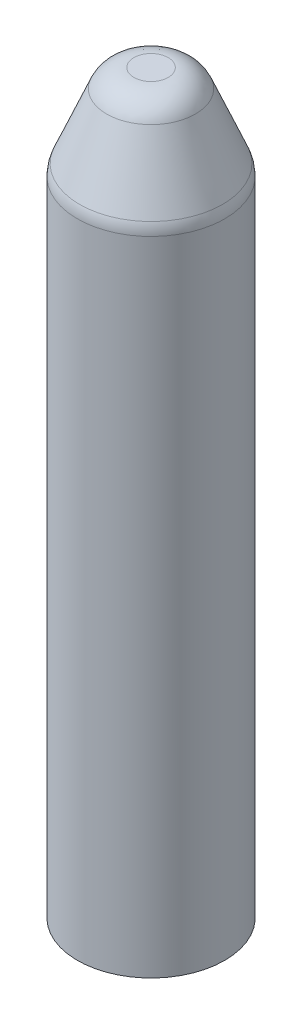
ISO-10303-21;
HEADER;
FILE_DESCRIPTION(('STEP AP214'),'2;1');
FILE_NAME('part.step','',(''),(''),'','','');
FILE_SCHEMA(('AUTOMOTIVE_DESIGN { 1 0 10303 214 1 1 1 1 }'));
ENDSEC;
DATA;
#1=APPLICATION_CONTEXT('core data for automotive mechanical design processes');
#2=APPLICATION_PROTOCOL_DEFINITION('international standard','automotive_design',2000,#1);
#3=PRODUCT_CONTEXT('',#1,'mechanical');
#4=PRODUCT('Part','Part','',(#3));
#5=PRODUCT_RELATED_PRODUCT_CATEGORY('part','',(#4));
#6=PRODUCT_DEFINITION_FORMATION('','',#4);
#7=PRODUCT_DEFINITION_CONTEXT('part definition',#1,'design');
#8=PRODUCT_DEFINITION('design','',#6,#7);
#9=PRODUCT_DEFINITION_SHAPE('','',#8);
#10=(LENGTH_UNIT() NAMED_UNIT(*) SI_UNIT(.MILLI.,.METRE.));
#11=(NAMED_UNIT(*) PLANE_ANGLE_UNIT() SI_UNIT($,.RADIAN.));
#12=(NAMED_UNIT(*) SI_UNIT($,.STERADIAN.) SOLID_ANGLE_UNIT());
#13=UNCERTAINTY_MEASURE_WITH_UNIT(LENGTH_MEASURE(1.E-05),#10,'distance_accuracy_value','');
#14=(GEOMETRIC_REPRESENTATION_CONTEXT(3) GLOBAL_UNCERTAINTY_ASSIGNED_CONTEXT((#13)) GLOBAL_UNIT_ASSIGNED_CONTEXT((#10,
#11,#12)) REPRESENTATION_CONTEXT('',''));
#15=CARTESIAN_POINT('',(0.,0.,0.));
#16=DIRECTION('',(0.,0.,1.));
#17=DIRECTION('',(1.,0.,0.));
#18=AXIS2_PLACEMENT_3D('',#15,#16,#17);
#19=CARTESIAN_POINT('',(0.,5.,-6.2));
#20=DIRECTION('',(0.,-1.,0.));
#21=DIRECTION('',(-1.,0.,0.));
#22=AXIS2_PLACEMENT_3D('',#19,#20,#21);
#23=PLANE('',#22);
#24=CARTESIAN_POINT('',(0.,5.,-6.2));
#25=DIRECTION('',(0.,-1.,0.));
#26=DIRECTION('',(1.,0.,0.));
#27=AXIS2_PLACEMENT_3D('',#24,#25,#26);
#28=CIRCLE('',#27,0.116666666667);
#29=CARTESIAN_POINT('',(0.116666666667,5.,-6.2));
#30=VERTEX_POINT('',#29);
#31=EDGE_CURVE('E28',#30,#30,#28,.T.);
#32=ORIENTED_EDGE('',*,*,#31,.F.);
#33=EDGE_LOOP('',(#32));
#34=FACE_BOUND('',#33,.T.);
#35=ADVANCED_FACE('F16',(#34),#23,.F.);
#36=CARTESIAN_POINT('',(0.301282051282,4.876923076923,-6.2));
#37=CARTESIAN_POINT('',(0.286205061447,4.913107852526,-6.2));
#38=CARTESIAN_POINT('',(0.262617997576,4.945746033968,-6.2));
#39=CARTESIAN_POINT('',(0.231559197431,4.972338796147,-6.2));
#40=CARTESIAN_POINT('',(0.19506633998,4.990780472366,-6.2));
#41=CARTESIAN_POINT('',(0.155866840237,5.,-6.2));
#42=CARTESIAN_POINT('',(0.116666666667,5.,-6.2));
#43=(BOUNDED_CURVE() B_SPLINE_CURVE(6,(#36,#37,#38,#39,#40,#41,#42),.UNSPECIFIED.,.F.,
.F.) B_SPLINE_CURVE_WITH_KNOTS((7,7),(0.3947911197,1.570796326795),
.UNSPECIFIED.) CURVE() GEOMETRIC_REPRESENTATION_ITEM() RATIONAL_B_SPLINE_CURVE((1.,1.,1.,1.,1.,
1.,1.)) REPRESENTATION_ITEM(''));
#44=CARTESIAN_POINT('',(0.,4.8,-6.2));
#45=DIRECTION('',(0.,-1.,0.));
#46=AXIS1_PLACEMENT('',#44,#45);
#47=SURFACE_OF_REVOLUTION('',#43,#46);
#48=ORIENTED_EDGE('',*,*,#31,.T.);
#49=CARTESIAN_POINT('',(0.116666666667,4.8,-6.2));
#50=DIRECTION('',(0.,0.,1.));
#51=DIRECTION('',(1.,0.,0.));
#52=AXIS2_PLACEMENT_3D('',#49,#50,#51);
#53=CIRCLE('',#52,0.2);
#54=CARTESIAN_POINT('',(0.301282051282,4.876923076923,-6.2));
#55=VERTEX_POINT('',#54);
#56=EDGE_CURVE('E11',#55,#30,#53,.T.);
#57=ORIENTED_EDGE('',*,*,#56,.F.);
#58=CARTESIAN_POINT('',(0.,4.876923076923,-6.2));
#59=DIRECTION('',(0.,-1.,0.));
#60=DIRECTION('',(1.,0.,0.));
#61=AXIS2_PLACEMENT_3D('',#58,#59,#60);
#62=CIRCLE('',#61,0.301282051282);
#63=EDGE_CURVE('E150',#55,#55,#62,.T.);
#64=ORIENTED_EDGE('',*,*,#63,.F.);
#65=ORIENTED_EDGE('',*,*,#56,.T.);
#66=EDGE_LOOP('',(#48,#57,#64,#65));
#67=FACE_BOUND('',#66,.T.);
#68=ADVANCED_FACE('F18',(#67),#47,.F.);
#69=CARTESIAN_POINT('',(0.,4.4,-6.2));
#70=DIRECTION('',(0.,-1.,0.));
#71=DIRECTION('',(1.,0.,0.));
#72=AXIS2_PLACEMENT_3D('',#69,#70,#71);
#73=CONICAL_SURFACE('',#72,0.5,0.3947911197);
#74=ORIENTED_EDGE('',*,*,#63,.T.);
#75=DIRECTION('',(-0.38461538461503,0.923076923077071,0.));
#76=VECTOR('',#75,1.);
#77=CARTESIAN_POINT('',(0.5,4.4,-6.2));
#78=LINE('',#77,#76);
#79=CARTESIAN_POINT('',(0.484615384615,4.436923076923,-6.2));
#80=VERTEX_POINT('',#79);
#81=EDGE_CURVE('E141',#80,#55,#78,.T.);
#82=ORIENTED_EDGE('',*,*,#81,.F.);
#83=CARTESIAN_POINT('',(0.484615384615,4.436923076923,-6.2));
#84=CARTESIAN_POINT('',(0.484615384615,4.436923076923,-5.927192615032));
#85=CARTESIAN_POINT('',(0.316637594826,4.436923076923,-5.647506525371));
#86=CARTESIAN_POINT('',(-0.04313086997286,4.436923076923,-5.479124184144));
#87=CARTESIAN_POINT('',(-0.460995407463,4.436923076923,-5.599990781822));
#88=CARTESIAN_POINT('',(-0.779681050796,4.436923076923,-5.917614139244));
#89=CARTESIAN_POINT('',(-0.779681050797,4.436923076923,-6.482385860756));
#90=CARTESIAN_POINT('',(-0.460995407463,4.436923076923,-6.800009218177));
#91=CARTESIAN_POINT('',(-0.04313086997321,4.436923076923,-6.920875815857));
#92=CARTESIAN_POINT('',(0.316637594826,4.436923076923,-6.752493474629));
#93=CARTESIAN_POINT('',(0.484615384615,4.436923076923,-6.472807384968));
#94=CARTESIAN_POINT('',(0.484615384615,4.436923076923,-6.2));
#95=(BOUNDED_CURVE() B_SPLINE_CURVE(11,(#83,#84,#85,#86,#87,#88,#89,#90,#91,#92,#93,#94),
.UNSPECIFIED.,.T.,.F.) B_SPLINE_CURVE_WITH_KNOTS((12,12),(0.,3.14159265359),
.UNSPECIFIED.) CURVE() GEOMETRIC_REPRESENTATION_ITEM() RATIONAL_B_SPLINE_CURVE((1.,1.,1.,1.,1.,
1.,1.,1.,1.,1.,1.,1.)) REPRESENTATION_ITEM(''));
#96=EDGE_CURVE('E68',#80,#80,#95,.T.);
#97=ORIENTED_EDGE('',*,*,#96,.F.);
#98=ORIENTED_EDGE('',*,*,#81,.T.);
#99=EDGE_LOOP('',(#74,#82,#97,#98));
#100=FACE_BOUND('',#99,.T.);
#101=ADVANCED_FACE('F134',(#100),#73,.T.);
#102=CARTESIAN_POINT('',(0.,0.,-6.2));
#103=DIRECTION('',(0.,-1.,0.));
#104=DIRECTION('',(-1.,0.,0.));
#105=AXIS2_PLACEMENT_3D('',#102,#103,#104);
#106=PLANE('',#105);
#107=CARTESIAN_POINT('',(0.,0.,-6.2));
#108=DIRECTION('',(0.,-1.,0.));
#109=DIRECTION('',(1.,0.,0.));
#110=AXIS2_PLACEMENT_3D('',#107,#108,#109);
#111=CIRCLE('',#110,0.5);
#112=CARTESIAN_POINT('',(0.5,0.,-6.2));
#113=VERTEX_POINT('',#112);
#114=EDGE_CURVE('E53',#113,#113,#111,.T.);
#115=ORIENTED_EDGE('',*,*,#114,.T.);
#116=EDGE_LOOP('',(#115));
#117=FACE_BOUND('',#116,.T.);
#118=ADVANCED_FACE('F54',(#117),#106,.T.);
#119=CARTESIAN_POINT('',(0.5,4.36,-6.2));
#120=CARTESIAN_POINT('',(0.5,4.36,-5.918532063128));
#121=CARTESIAN_POINT('',(0.326689581963,4.36,-5.629967049986));
#122=CARTESIAN_POINT('',(-0.04450010394026,4.36,-5.456239237608));
#123=CARTESIAN_POINT('',(-0.475630182303,4.36,-5.580942870134));
#124=CARTESIAN_POINT('',(-0.804432830186,4.36,-5.908649508744));
#125=CARTESIAN_POINT('',(-0.804432830187,4.36,-6.491350491256));
#126=CARTESIAN_POINT('',(-0.475630182303,4.36,-6.819057129865));
#127=CARTESIAN_POINT('',(-0.04450010394061,4.36,-6.943760762392));
#128=CARTESIAN_POINT('',(0.326689581963,4.36,-6.770032950014));
#129=CARTESIAN_POINT('',(0.5,4.36,-6.481467936872));
#130=CARTESIAN_POINT('',(0.5,4.36,-6.2));
#131=CARTESIAN_POINT('',(0.5,4.4,-6.2));
#132=CARTESIAN_POINT('',(0.5,4.4,-5.918532063128));
#133=CARTESIAN_POINT('',(0.326689581963,4.4,-5.629967049986));
#134=CARTESIAN_POINT('',(-0.04450010394022,4.4,-5.456239237608));
#135=CARTESIAN_POINT('',(-0.475630182303,4.4,-5.580942870134));
#136=CARTESIAN_POINT('',(-0.804432830187,4.4,-5.908649508744));
#137=CARTESIAN_POINT('',(-0.804432830187,4.4,-6.491350491256));
#138=CARTESIAN_POINT('',(-0.475630182303,4.4,-6.819057129866));
#139=CARTESIAN_POINT('',(-0.04450010394063,4.4,-6.943760762392));
#140=CARTESIAN_POINT('',(0.326689581963,4.4,-6.770032950014));
#141=CARTESIAN_POINT('',(0.5,4.4,-6.481467936872));
#142=CARTESIAN_POINT('',(0.5,4.4,-6.2));
#143=CARTESIAN_POINT('',(0.484615384615,4.436923076923,-6.2));
#144=CARTESIAN_POINT('',(0.484615384615,4.436923076923,-5.927192615032));
#145=CARTESIAN_POINT('',(0.316637594826,4.436923076923,-5.647506525371));
#146=CARTESIAN_POINT('',(-0.04313086997286,4.436923076923,-5.479124184144));
#147=CARTESIAN_POINT('',(-0.460995407463,4.436923076923,-5.599990781822));
#148=CARTESIAN_POINT('',(-0.779681050796,4.436923076923,-5.917614139244));
#149=CARTESIAN_POINT('',(-0.779681050797,4.436923076923,-6.482385860756));
#150=CARTESIAN_POINT('',(-0.460995407463,4.436923076923,-6.800009218177));
#151=CARTESIAN_POINT('',(-0.04313086997321,4.436923076923,-6.920875815857));
#152=CARTESIAN_POINT('',(0.316637594826,4.436923076923,-6.752493474629));
#153=CARTESIAN_POINT('',(0.484615384615,4.436923076923,-6.472807384968));
#154=CARTESIAN_POINT('',(0.484615384615,4.436923076923,-6.2));
#155=(BOUNDED_SURFACE() B_SPLINE_SURFACE(2,11,((#119,#120,#121,#122,#123,#124,#125,#126,#127,
#128,#129,#130),(#131,#132,#133,#134,#135,#136,#137,#138,#139,#140,#141,#142),(#143,#144,#145,
#146,#147,#148,#149,#150,#151,#152,#153,#154)),.UNSPECIFIED.,.F.,.T.,
.F.) B_SPLINE_SURFACE_WITH_KNOTS((3,3),(12,12),(0.,3.14159265359),(0.,3.14159265359),
.UNSPECIFIED.) GEOMETRIC_REPRESENTATION_ITEM() RATIONAL_B_SPLINE_SURFACE(((1.,1.,1.,1.,1.,1.,1.,
1.,1.,1.,1.,1.),(0.980580675691,0.980580675691,0.980580675691,0.980580675691,0.980580675691,
0.98058067569,0.980580675691,0.980580675691,0.980580675691,0.980580675691,0.980580675691,
0.980580675691),(1.,1.,1.,1.,1.,1.,1.,1.,1.,1.,1.,1.))) REPRESENTATION_ITEM('') SURFACE());
#156=CARTESIAN_POINT('',(0.5,4.36,-6.2));
#157=CARTESIAN_POINT('',(0.5,4.4,-6.2));
#158=CARTESIAN_POINT('',(0.484615384615,4.436923076923,-6.2));
#159=(BOUNDED_CURVE() B_SPLINE_CURVE(2,(#156,#157,#158),.UNSPECIFIED.,.F.,
.F.) B_SPLINE_CURVE_WITH_KNOTS((3,3),(0.,3.14159265359),
.UNSPECIFIED.) CURVE() GEOMETRIC_REPRESENTATION_ITEM() RATIONAL_B_SPLINE_CURVE((1.,
0.980580675691,1.)) REPRESENTATION_ITEM(''));
#160=CARTESIAN_POINT('',(0.5,4.36,-6.2));
#161=VERTEX_POINT('',#160);
#162=EDGE_CURVE('E59',#161,#80,#159,.T.);
#163=CARTESIAN_POINT('',(0.5,4.36,-6.2));
#164=CARTESIAN_POINT('',(0.5,4.36,-6.481467936872));
#165=CARTESIAN_POINT('',(0.326689581963,4.36,-6.770032950014));
#166=CARTESIAN_POINT('',(-0.04450010394061,4.36,-6.943760762392));
#167=CARTESIAN_POINT('',(-0.475630182303,4.36,-6.819057129865));
#168=CARTESIAN_POINT('',(-0.804432830187,4.36,-6.491350491256));
#169=CARTESIAN_POINT('',(-0.804432830186,4.36,-5.908649508744));
#170=CARTESIAN_POINT('',(-0.475630182303,4.36,-5.580942870134));
#171=CARTESIAN_POINT('',(-0.04450010394026,4.36,-5.456239237608));
#172=CARTESIAN_POINT('',(0.326689581963,4.36,-5.629967049986));
#173=CARTESIAN_POINT('',(0.5,4.36,-5.918532063128));
#174=CARTESIAN_POINT('',(0.5,4.36,-6.2));
#175=(BOUNDED_CURVE() B_SPLINE_CURVE(11,(#163,#164,#165,#166,#167,#168,#169,#170,#171,#172,#173,
#174),.UNSPECIFIED.,.T.,.F.) B_SPLINE_CURVE_WITH_KNOTS((12,12),(0.,3.14159265359),
.UNSPECIFIED.) CURVE() GEOMETRIC_REPRESENTATION_ITEM() RATIONAL_B_SPLINE_CURVE((1.,1.,1.,1.,1.,
1.,1.,1.,1.,1.,1.,1.)) REPRESENTATION_ITEM(''));
#176=EDGE_CURVE('E60',#161,#161,#175,.F.);
#177=ORIENTED_EDGE('',*,*,#162,.T.);
#178=ORIENTED_EDGE('',*,*,#96,.T.);
#179=ORIENTED_EDGE('',*,*,#162,.F.);
#180=ORIENTED_EDGE('',*,*,#176,.F.);
#181=EDGE_LOOP('',(#177,#178,#179,#180));
#182=FACE_BOUND('',#181,.T.);
#183=ADVANCED_FACE('F83',(#182),#155,.T.);
#184=CARTESIAN_POINT('',(0.,0.,-6.2));
#185=DIRECTION('',(0.,-1.,0.));
#186=DIRECTION('',(1.,0.,0.));
#187=AXIS2_PLACEMENT_3D('',#184,#185,#186);
#188=CYLINDRICAL_SURFACE('',#187,0.5);
#189=DIRECTION('',(0.,1.,0.));
#190=VECTOR('',#189,1.);
#191=CARTESIAN_POINT('',(0.5,0.,-6.2));
#192=LINE('',#191,#190);
#193=EDGE_CURVE('E71',#113,#161,#192,.T.);
#194=ORIENTED_EDGE('',*,*,#193,.T.);
#195=ORIENTED_EDGE('',*,*,#176,.T.);
#196=ORIENTED_EDGE('',*,*,#193,.F.);
#197=ORIENTED_EDGE('',*,*,#114,.F.);
#198=EDGE_LOOP('',(#194,#195,#196,#197));
#199=FACE_BOUND('',#198,.T.);
#200=ADVANCED_FACE('F94',(#199),#188,.T.);
#201=CLOSED_SHELL('',(#35,#68,#101,#118,#183,#200));
#202=MANIFOLD_SOLID_BREP('B1',#201);
#203=ADVANCED_BREP_SHAPE_REPRESENTATION('',(#18,#202),#14);
#204=SHAPE_DEFINITION_REPRESENTATION(#9,#203);
ENDSEC;
END-ISO-10303-21;
